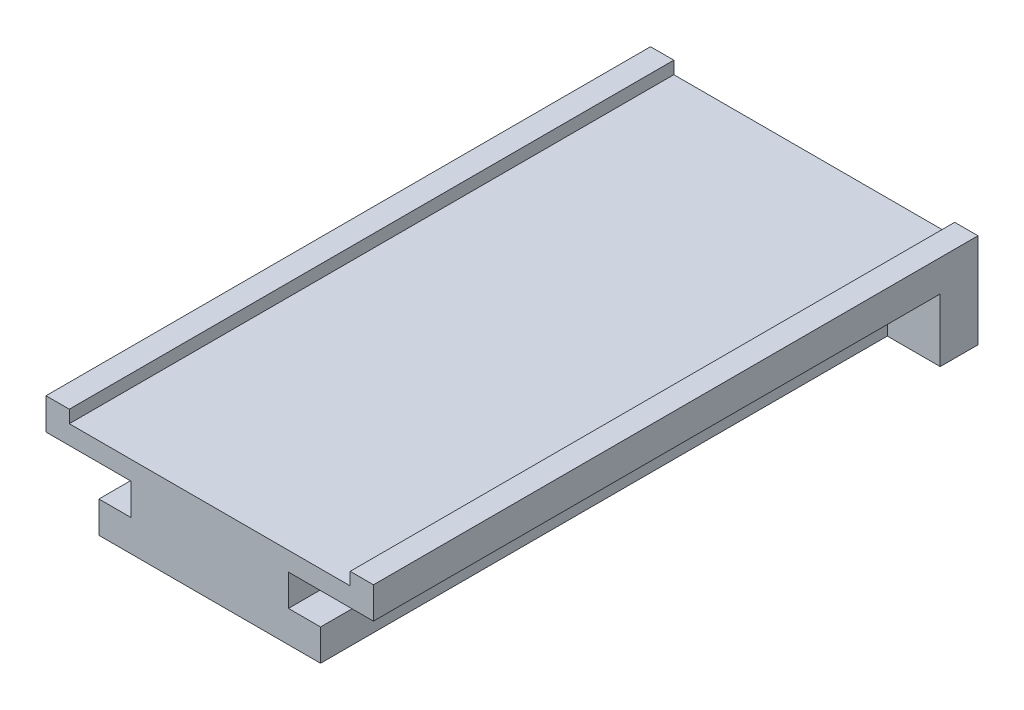
ISO-10303-21;
HEADER;
FILE_DESCRIPTION(('STEP AP214'),'2;1');
FILE_NAME('part.step','',(''),(''),'','','');
FILE_SCHEMA(('AUTOMOTIVE_DESIGN { 1 0 10303 214 1 1 1 1 }'));
ENDSEC;
DATA;
#1=APPLICATION_CONTEXT('core data for automotive mechanical design processes');
#2=APPLICATION_PROTOCOL_DEFINITION('international standard','automotive_design',2000,#1);
#3=PRODUCT_CONTEXT('',#1,'mechanical');
#4=PRODUCT('Part','Part','',(#3));
#5=PRODUCT_RELATED_PRODUCT_CATEGORY('part','',(#4));
#6=PRODUCT_DEFINITION_FORMATION('','',#4);
#7=PRODUCT_DEFINITION_CONTEXT('part definition',#1,'design');
#8=PRODUCT_DEFINITION('design','',#6,#7);
#9=PRODUCT_DEFINITION_SHAPE('','',#8);
#10=(LENGTH_UNIT() NAMED_UNIT(*) SI_UNIT(.MILLI.,.METRE.));
#11=(NAMED_UNIT(*) PLANE_ANGLE_UNIT() SI_UNIT($,.RADIAN.));
#12=(NAMED_UNIT(*) SI_UNIT($,.STERADIAN.) SOLID_ANGLE_UNIT());
#13=UNCERTAINTY_MEASURE_WITH_UNIT(LENGTH_MEASURE(1.E-05),#10,'distance_accuracy_value','');
#14=(GEOMETRIC_REPRESENTATION_CONTEXT(3) GLOBAL_UNCERTAINTY_ASSIGNED_CONTEXT((#13)) GLOBAL_UNIT_ASSIGNED_CONTEXT((#10,
#11,#12)) REPRESENTATION_CONTEXT('',''));
#15=CARTESIAN_POINT('',(0.,0.,0.));
#16=DIRECTION('',(0.,0.,1.));
#17=DIRECTION('',(1.,0.,0.));
#18=AXIS2_PLACEMENT_3D('',#15,#16,#17);
#19=CARTESIAN_POINT('',(0.,2.78985507246377,45.));
#20=DIRECTION('',(0.,1.,0.));
#21=DIRECTION('',(0.,0.,1.));
#22=AXIS2_PLACEMENT_3D('',#19,#20,#21);
#23=PLANE('',#22);
#24=DIRECTION('',(1.,0.,0.));
#25=VECTOR('',#24,1.);
#26=CARTESIAN_POINT('',(9.79710144927535,2.78985507246377,-3.));
#27=LINE('',#26,#25);
#28=CARTESIAN_POINT('',(7.94710144927535,2.78985507246377,-3.));
#29=VERTEX_POINT('',#28);
#30=CARTESIAN_POINT('',(9.79710144927535,2.78985507246377,-3.));
#31=VERTEX_POINT('',#30);
#32=EDGE_CURVE('E170',#29,#31,#27,.T.);
#33=ORIENTED_EDGE('',*,*,#32,.F.);
#34=DIRECTION('',(0.,0.,1.));
#35=VECTOR('',#34,1.);
#36=CARTESIAN_POINT('',(7.94710144927535,2.78985507246377,0.));
#37=LINE('',#36,#35);
#38=CARTESIAN_POINT('',(7.94710144927535,2.78985507246377,45.));
#39=VERTEX_POINT('',#38);
#40=EDGE_CURVE('E325',#29,#39,#37,.T.);
#41=ORIENTED_EDGE('',*,*,#40,.T.);
#42=DIRECTION('',(1.,0.,0.));
#43=VECTOR('',#42,1.);
#44=CARTESIAN_POINT('',(0.,2.78985507246377,45.));
#45=LINE('',#44,#43);
#46=CARTESIAN_POINT('',(9.79710144927535,2.78985507246377,45.));
#47=VERTEX_POINT('',#46);
#48=EDGE_CURVE('E172',#39,#47,#45,.T.);
#49=ORIENTED_EDGE('',*,*,#48,.T.);
#50=DIRECTION('',(0.,0.,-1.));
#51=VECTOR('',#50,1.);
#52=CARTESIAN_POINT('',(9.79710144927535,2.78985507246377,45.));
#53=LINE('',#52,#51);
#54=EDGE_CURVE('E50',#47,#31,#53,.T.);
#55=ORIENTED_EDGE('',*,*,#54,.T.);
#56=EDGE_LOOP('',(#33,#41,#49,#55));
#57=FACE_BOUND('',#56,.T.);
#58=ADVANCED_FACE('F41',(#57),#23,.T.);
#59=CARTESIAN_POINT('',(0.,0.289855072463773,45.));
#60=DIRECTION('',(0.,1.,0.));
#61=DIRECTION('',(0.,0.,1.));
#62=AXIS2_PLACEMENT_3D('',#59,#60,#61);
#63=PLANE('',#62);
#64=DIRECTION('',(1.,0.,0.));
#65=VECTOR('',#64,1.);
#66=CARTESIAN_POINT('',(0.,0.289855072463773,0.));
#67=LINE('',#66,#65);
#68=CARTESIAN_POINT('',(3.04710144927535,0.289855072463773,0.));
#69=VERTEX_POINT('',#68);
#70=CARTESIAN_POINT('',(9.79710144927535,0.289855072463773,0.));
#71=VERTEX_POINT('',#70);
#72=EDGE_CURVE('E142',#69,#71,#67,.T.);
#73=ORIENTED_EDGE('',*,*,#72,.T.);
#74=DIRECTION('',(0.,0.,-1.));
#75=VECTOR('',#74,1.);
#76=CARTESIAN_POINT('',(9.79710144927535,0.289855072463773,45.));
#77=LINE('',#76,#75);
#78=CARTESIAN_POINT('',(9.79710144927535,0.289855072463773,45.));
#79=VERTEX_POINT('',#78);
#80=EDGE_CURVE('E11',#79,#71,#77,.T.);
#81=ORIENTED_EDGE('',*,*,#80,.F.);
#82=DIRECTION('',(1.,0.,0.));
#83=VECTOR('',#82,1.);
#84=CARTESIAN_POINT('',(0.,0.289855072463773,45.));
#85=LINE('',#84,#83);
#86=CARTESIAN_POINT('',(3.04710144927535,0.289855072463773,45.));
#87=VERTEX_POINT('',#86);
#88=EDGE_CURVE('E155',#87,#79,#85,.T.);
#89=ORIENTED_EDGE('',*,*,#88,.F.);
#90=DIRECTION('',(0.,0.,-1.));
#91=VECTOR('',#90,1.);
#92=CARTESIAN_POINT('',(3.04710144927535,0.289855072463773,45.));
#93=LINE('',#92,#91);
#94=EDGE_CURVE('E66',#87,#69,#93,.T.);
#95=ORIENTED_EDGE('',*,*,#94,.T.);
#96=EDGE_LOOP('',(#73,#81,#89,#95));
#97=FACE_BOUND('',#96,.T.);
#98=ADVANCED_FACE('F43',(#97),#63,.F.);
#99=CARTESIAN_POINT('',(9.79710144927535,0.,45.));
#100=DIRECTION('',(-1.,0.,0.));
#101=DIRECTION('',(0.,0.,1.));
#102=AXIS2_PLACEMENT_3D('',#99,#100,#101);
#103=PLANE('',#102);
#104=ORIENTED_EDGE('',*,*,#80,.T.);
#105=DIRECTION('',(0.,-1.,0.));
#106=VECTOR('',#105,1.);
#107=CARTESIAN_POINT('',(9.79710144927535,2.78985507246377,0.));
#108=LINE('',#107,#106);
#109=CARTESIAN_POINT('',(9.79710144927535,-4.71014492753623,0.));
#110=VERTEX_POINT('',#109);
#111=EDGE_CURVE('E209',#71,#110,#108,.T.);
#112=ORIENTED_EDGE('',*,*,#111,.T.);
#113=DIRECTION('',(0.,0.,1.));
#114=VECTOR('',#113,1.);
#115=CARTESIAN_POINT('',(9.79710144927535,-4.71014492753623,-3.));
#116=LINE('',#115,#114);
#117=CARTESIAN_POINT('',(9.79710144927535,-4.71014492753623,-3.));
#118=VERTEX_POINT('',#117);
#119=EDGE_CURVE('E183',#118,#110,#116,.T.);
#120=ORIENTED_EDGE('',*,*,#119,.F.);
#121=DIRECTION('',(0.,-1.,0.));
#122=VECTOR('',#121,1.);
#123=CARTESIAN_POINT('',(9.79710144927535,2.78985507246377,-3.));
#124=LINE('',#123,#122);
#125=EDGE_CURVE('E178',#31,#118,#124,.T.);
#126=ORIENTED_EDGE('',*,*,#125,.F.);
#127=ORIENTED_EDGE('',*,*,#54,.F.);
#128=DIRECTION('',(0.,1.,0.));
#129=VECTOR('',#128,1.);
#130=CARTESIAN_POINT('',(9.79710144927535,0.,45.));
#131=LINE('',#130,#129);
#132=EDGE_CURVE('E94',#79,#47,#131,.T.);
#133=ORIENTED_EDGE('',*,*,#132,.F.);
#134=EDGE_LOOP('',(#104,#112,#120,#126,#127,#133));
#135=FACE_BOUND('',#134,.T.);
#136=ADVANCED_FACE('F179',(#135),#103,.F.);
#137=DIRECTION('',(0.,0.,1.));
#138=VECTOR('',#137,1.);
#139=CARTESIAN_POINT('',(-14.3528985507247,2.78985507246377,0.));
#140=LINE('',#139,#138);
#141=CARTESIAN_POINT('',(-14.3528985507247,2.78985507246377,-3.));
#142=VERTEX_POINT('',#141);
#143=CARTESIAN_POINT('',(-14.3528985507247,2.78985507246377,45.));
#144=VERTEX_POINT('',#143);
#145=EDGE_CURVE('E320',#142,#144,#140,.T.);
#146=ORIENTED_EDGE('',*,*,#145,.F.);
#147=CARTESIAN_POINT('',(-16.2028985507246,2.78985507246377,-3.));
#148=VERTEX_POINT('',#147);
#149=EDGE_CURVE('E204',#148,#142,#27,.T.);
#150=ORIENTED_EDGE('',*,*,#149,.F.);
#151=DIRECTION('',(0.,0.,-1.));
#152=VECTOR('',#151,1.);
#153=CARTESIAN_POINT('',(-16.2028985507246,2.78985507246377,45.));
#154=LINE('',#153,#152);
#155=CARTESIAN_POINT('',(-16.2028985507246,2.78985507246377,45.));
#156=VERTEX_POINT('',#155);
#157=EDGE_CURVE('E269',#156,#148,#154,.T.);
#158=ORIENTED_EDGE('',*,*,#157,.F.);
#159=EDGE_CURVE('E292',#156,#144,#45,.T.);
#160=ORIENTED_EDGE('',*,*,#159,.T.);
#161=EDGE_LOOP('',(#146,#150,#158,#160));
#162=FACE_BOUND('',#161,.T.);
#163=ADVANCED_FACE('F412',(#162),#23,.T.);
#164=CARTESIAN_POINT('',(0.,-4.71014492753623,45.));
#165=DIRECTION('',(0.,1.,0.));
#166=DIRECTION('',(0.,0.,1.));
#167=AXIS2_PLACEMENT_3D('',#164,#165,#166);
#168=PLANE('',#167);
#169=CARTESIAN_POINT('',(-3.20289855072465,-4.71014492753623,32.5));
#170=DIRECTION('',(0.,-1.,0.));
#171=DIRECTION('',(0.,0.,-1.));
#172=AXIS2_PLACEMENT_3D('',#169,#170,#171);
#173=CIRCLE('',#172,1.5);
#174=CARTESIAN_POINT('',(-3.20289855072465,-4.71014492753623,31.));
#175=VERTEX_POINT('',#174);
#176=EDGE_CURVE('E223',#175,#175,#173,.T.);
#177=ORIENTED_EDGE('',*,*,#176,.F.);
#178=EDGE_LOOP('',(#177));
#179=FACE_BOUND('',#178,.T.);
#180=CARTESIAN_POINT('',(-3.20289855072465,-4.71014492753623,12.5));
#181=DIRECTION('',(0.,-1.,0.));
#182=DIRECTION('',(0.,0.,1.));
#183=AXIS2_PLACEMENT_3D('',#180,#181,#182);
#184=CIRCLE('',#183,1.5);
#185=CARTESIAN_POINT('',(-3.20289855072465,-4.71014492753623,14.));
#186=VERTEX_POINT('',#185);
#187=EDGE_CURVE('E222',#186,#186,#184,.T.);
#188=ORIENTED_EDGE('',*,*,#187,.F.);
#189=EDGE_LOOP('',(#188));
#190=FACE_BOUND('',#189,.T.);
#191=DIRECTION('',(0.,0.,-1.));
#192=VECTOR('',#191,1.);
#193=CARTESIAN_POINT('',(-12.0028985507247,-4.71014492753623,45.));
#194=LINE('',#193,#192);
#195=CARTESIAN_POINT('',(-12.0028985507247,-4.71014492753623,45.));
#196=VERTEX_POINT('',#195);
#197=CARTESIAN_POINT('',(-12.0028985507247,-4.71014492753623,0.));
#198=VERTEX_POINT('',#197);
#199=EDGE_CURVE('E273',#196,#198,#194,.T.);
#200=ORIENTED_EDGE('',*,*,#199,.T.);
#201=DIRECTION('',(-1.,0.,0.));
#202=VECTOR('',#201,1.);
#203=CARTESIAN_POINT('',(9.79710144927535,-4.71014492753623,0.));
#204=LINE('',#203,#202);
#205=CARTESIAN_POINT('',(-16.2028985507246,-4.71014492753623,0.));
#206=VERTEX_POINT('',#205);
#207=EDGE_CURVE('E212',#198,#206,#204,.T.);
#208=ORIENTED_EDGE('',*,*,#207,.T.);
#209=DIRECTION('',(0.,0.,1.));
#210=VECTOR('',#209,1.);
#211=CARTESIAN_POINT('',(-16.2028985507246,-4.71014492753623,-3.));
#212=LINE('',#211,#210);
#213=CARTESIAN_POINT('',(-16.2028985507246,-4.71014492753623,-3.));
#214=VERTEX_POINT('',#213);
#215=EDGE_CURVE('E208',#214,#206,#212,.T.);
#216=ORIENTED_EDGE('',*,*,#215,.F.);
#217=DIRECTION('',(-1.,0.,0.));
#218=VECTOR('',#217,1.);
#219=CARTESIAN_POINT('',(9.79710144927535,-4.71014492753623,-3.));
#220=LINE('',#219,#218);
#221=EDGE_CURVE('E187',#118,#214,#220,.T.);
#222=ORIENTED_EDGE('',*,*,#221,.F.);
#223=ORIENTED_EDGE('',*,*,#119,.T.);
#224=CARTESIAN_POINT('',(5.59710144927535,-4.71014492753623,0.));
#225=VERTEX_POINT('',#224);
#226=EDGE_CURVE('E195',#110,#225,#204,.T.);
#227=ORIENTED_EDGE('',*,*,#226,.T.);
#228=DIRECTION('',(0.,0.,-1.));
#229=VECTOR('',#228,1.);
#230=CARTESIAN_POINT('',(5.59710144927535,-4.71014492753623,45.));
#231=LINE('',#230,#229);
#232=CARTESIAN_POINT('',(5.59710144927535,-4.71014492753623,45.));
#233=VERTEX_POINT('',#232);
#234=EDGE_CURVE('E119',#233,#225,#231,.T.);
#235=ORIENTED_EDGE('',*,*,#234,.F.);
#236=DIRECTION('',(1.,0.,0.));
#237=VECTOR('',#236,1.);
#238=CARTESIAN_POINT('',(0.,-4.71014492753623,45.));
#239=LINE('',#238,#237);
#240=EDGE_CURVE('E130',#196,#233,#239,.T.);
#241=ORIENTED_EDGE('',*,*,#240,.F.);
#242=EDGE_LOOP('',(#200,#208,#216,#222,#223,#227,#235,#241));
#243=FACE_BOUND('',#242,.T.);
#244=ADVANCED_FACE('F392',(#179,#190,#243),#168,.F.);
#245=CARTESIAN_POINT('',(5.59710144927535,0.,45.));
#246=DIRECTION('',(1.,0.,0.));
#247=DIRECTION('',(0.,1.,0.));
#248=AXIS2_PLACEMENT_3D('',#245,#246,#247);
#249=PLANE('',#248);
#250=DIRECTION('',(0.,-1.,0.));
#251=VECTOR('',#250,1.);
#252=CARTESIAN_POINT('',(5.59710144927535,0.,0.));
#253=LINE('',#252,#251);
#254=CARTESIAN_POINT('',(5.59710144927535,-2.21014492753623,0.));
#255=VERTEX_POINT('',#254);
#256=EDGE_CURVE('E113',#255,#225,#253,.T.);
#257=ORIENTED_EDGE('',*,*,#256,.F.);
#258=DIRECTION('',(0.,0.,-1.));
#259=VECTOR('',#258,1.);
#260=CARTESIAN_POINT('',(5.59710144927535,-2.21014492753623,45.));
#261=LINE('',#260,#259);
#262=CARTESIAN_POINT('',(5.59710144927535,-2.21014492753623,45.));
#263=VERTEX_POINT('',#262);
#264=EDGE_CURVE('E108',#263,#255,#261,.T.);
#265=ORIENTED_EDGE('',*,*,#264,.F.);
#266=DIRECTION('',(0.,-1.,0.));
#267=VECTOR('',#266,1.);
#268=CARTESIAN_POINT('',(5.59710144927535,0.,45.));
#269=LINE('',#268,#267);
#270=EDGE_CURVE('E111',#263,#233,#269,.T.);
#271=ORIENTED_EDGE('',*,*,#270,.T.);
#272=ORIENTED_EDGE('',*,*,#234,.T.);
#273=EDGE_LOOP('',(#257,#265,#271,#272));
#274=FACE_BOUND('',#273,.T.);
#275=ADVANCED_FACE('F110',(#274),#249,.T.);
#276=CARTESIAN_POINT('',(0.,-2.21014492753623,45.));
#277=DIRECTION('',(0.,1.,0.));
#278=DIRECTION('',(0.,0.,1.));
#279=AXIS2_PLACEMENT_3D('',#276,#277,#278);
#280=PLANE('',#279);
#281=DIRECTION('',(1.,0.,0.));
#282=VECTOR('',#281,1.);
#283=CARTESIAN_POINT('',(0.,-2.21014492753623,0.));
#284=LINE('',#283,#282);
#285=CARTESIAN_POINT('',(3.04710144927535,-2.21014492753623,0.));
#286=VERTEX_POINT('',#285);
#287=EDGE_CURVE('E148',#286,#255,#284,.T.);
#288=ORIENTED_EDGE('',*,*,#287,.F.);
#289=DIRECTION('',(0.,0.,-1.));
#290=VECTOR('',#289,1.);
#291=CARTESIAN_POINT('',(3.04710144927535,-2.21014492753623,45.));
#292=LINE('',#291,#290);
#293=CARTESIAN_POINT('',(3.04710144927535,-2.21014492753623,45.));
#294=VERTEX_POINT('',#293);
#295=EDGE_CURVE('E120',#294,#286,#292,.T.);
#296=ORIENTED_EDGE('',*,*,#295,.F.);
#297=DIRECTION('',(1.,0.,0.));
#298=VECTOR('',#297,1.);
#299=CARTESIAN_POINT('',(0.,-2.21014492753623,45.));
#300=LINE('',#299,#298);
#301=EDGE_CURVE('E127',#294,#263,#300,.T.);
#302=ORIENTED_EDGE('',*,*,#301,.T.);
#303=ORIENTED_EDGE('',*,*,#264,.T.);
#304=EDGE_LOOP('',(#288,#296,#302,#303));
#305=FACE_BOUND('',#304,.T.);
#306=ADVANCED_FACE('F134',(#305),#280,.T.);
#307=CARTESIAN_POINT('',(3.04710144927535,0.,45.));
#308=DIRECTION('',(1.,0.,0.));
#309=DIRECTION('',(0.,0.,-1.));
#310=AXIS2_PLACEMENT_3D('',#307,#308,#309);
#311=PLANE('',#310);
#312=DIRECTION('',(0.,-1.,0.));
#313=VECTOR('',#312,1.);
#314=CARTESIAN_POINT('',(3.04710144927535,0.,0.));
#315=LINE('',#314,#313);
#316=EDGE_CURVE('E151',#69,#286,#315,.T.);
#317=ORIENTED_EDGE('',*,*,#316,.F.);
#318=ORIENTED_EDGE('',*,*,#94,.F.);
#319=DIRECTION('',(0.,-1.,0.));
#320=VECTOR('',#319,1.);
#321=CARTESIAN_POINT('',(3.04710144927535,0.,45.));
#322=LINE('',#321,#320);
#323=EDGE_CURVE('E136',#87,#294,#322,.T.);
#324=ORIENTED_EDGE('',*,*,#323,.T.);
#325=ORIENTED_EDGE('',*,*,#295,.T.);
#326=EDGE_LOOP('',(#317,#318,#324,#325));
#327=FACE_BOUND('',#326,.T.);
#328=ADVANCED_FACE('F517',(#327),#311,.T.);
#329=CARTESIAN_POINT('',(0.,0.,45.));
#330=DIRECTION('',(0.,0.,1.));
#331=DIRECTION('',(1.,0.,0.));
#332=AXIS2_PLACEMENT_3D('',#329,#330,#331);
#333=PLANE('',#332);
#334=DIRECTION('',(0.,1.,0.));
#335=VECTOR('',#334,1.);
#336=CARTESIAN_POINT('',(-14.3528985507247,1.78985507246377,45.));
#337=LINE('',#336,#335);
#338=CARTESIAN_POINT('',(-14.3528985507247,1.78985507246377,45.));
#339=VERTEX_POINT('',#338);
#340=EDGE_CURVE('E213',#339,#144,#337,.T.);
#341=ORIENTED_EDGE('',*,*,#340,.T.);
#342=ORIENTED_EDGE('',*,*,#159,.F.);
#343=DIRECTION('',(0.,1.,0.));
#344=VECTOR('',#343,1.);
#345=CARTESIAN_POINT('',(-16.2028985507246,0.,45.));
#346=LINE('',#345,#344);
#347=CARTESIAN_POINT('',(-16.2028985507246,0.289855072463773,45.));
#348=VERTEX_POINT('',#347);
#349=EDGE_CURVE('E247',#348,#156,#346,.T.);
#350=ORIENTED_EDGE('',*,*,#349,.F.);
#351=DIRECTION('',(-1.,0.,0.));
#352=VECTOR('',#351,1.);
#353=CARTESIAN_POINT('',(-6.4057971014493,0.289855072463773,45.));
#354=LINE('',#353,#352);
#355=CARTESIAN_POINT('',(-9.45289855072465,0.289855072463773,45.));
#356=VERTEX_POINT('',#355);
#357=EDGE_CURVE('E231',#356,#348,#354,.T.);
#358=ORIENTED_EDGE('',*,*,#357,.F.);
#359=DIRECTION('',(0.,-1.,0.));
#360=VECTOR('',#359,1.);
#361=CARTESIAN_POINT('',(-9.45289855072465,0.,45.));
#362=LINE('',#361,#360);
#363=CARTESIAN_POINT('',(-9.45289855072465,-2.21014492753623,45.));
#364=VERTEX_POINT('',#363);
#365=EDGE_CURVE('E235',#356,#364,#362,.T.);
#366=ORIENTED_EDGE('',*,*,#365,.T.);
#367=DIRECTION('',(-1.,0.,0.));
#368=VECTOR('',#367,1.);
#369=CARTESIAN_POINT('',(-6.4057971014493,-2.21014492753623,45.));
#370=LINE('',#369,#368);
#371=CARTESIAN_POINT('',(-12.0028985507247,-2.21014492753623,45.));
#372=VERTEX_POINT('',#371);
#373=EDGE_CURVE('E240',#364,#372,#370,.T.);
#374=ORIENTED_EDGE('',*,*,#373,.T.);
#375=DIRECTION('',(0.,-1.,0.));
#376=VECTOR('',#375,1.);
#377=CARTESIAN_POINT('',(-12.0028985507246,0.,45.));
#378=LINE('',#377,#376);
#379=EDGE_CURVE('E244',#372,#196,#378,.T.);
#380=ORIENTED_EDGE('',*,*,#379,.T.);
#381=ORIENTED_EDGE('',*,*,#240,.T.);
#382=ORIENTED_EDGE('',*,*,#270,.F.);
#383=ORIENTED_EDGE('',*,*,#301,.F.);
#384=ORIENTED_EDGE('',*,*,#323,.F.);
#385=ORIENTED_EDGE('',*,*,#88,.T.);
#386=ORIENTED_EDGE('',*,*,#132,.T.);
#387=ORIENTED_EDGE('',*,*,#48,.F.);
#388=DIRECTION('',(0.,1.,0.));
#389=VECTOR('',#388,1.);
#390=CARTESIAN_POINT('',(7.94710144927535,1.78985507246377,45.));
#391=LINE('',#390,#389);
#392=CARTESIAN_POINT('',(7.94710144927535,1.78985507246377,45.));
#393=VERTEX_POINT('',#392);
#394=EDGE_CURVE('E198',#393,#39,#391,.T.);
#395=ORIENTED_EDGE('',*,*,#394,.F.);
#396=DIRECTION('',(1.,0.,0.));
#397=VECTOR('',#396,1.);
#398=CARTESIAN_POINT('',(0.,1.78985507246377,45.));
#399=LINE('',#398,#397);
#400=EDGE_CURVE('E324',#339,#393,#399,.T.);
#401=ORIENTED_EDGE('',*,*,#400,.F.);
#402=EDGE_LOOP('',(#341,#342,#350,#358,#366,#374,#380,#381,#382,#383,#384,#385,#386,#387,#395,#401));
#403=FACE_BOUND('',#402,.T.);
#404=ADVANCED_FACE('F125',(#403),#333,.T.);
#405=CARTESIAN_POINT('',(-6.4057971014493,0.289855072463773,45.));
#406=DIRECTION('',(0.,-1.,0.));
#407=DIRECTION('',(0.,0.,-1.));
#408=AXIS2_PLACEMENT_3D('',#405,#406,#407);
#409=PLANE('',#408);
#410=DIRECTION('',(-1.,0.,0.));
#411=VECTOR('',#410,1.);
#412=CARTESIAN_POINT('',(-6.4057971014493,0.289855072463773,0.));
#413=LINE('',#412,#411);
#414=CARTESIAN_POINT('',(-9.45289855072465,0.289855072463773,0.));
#415=VERTEX_POINT('',#414);
#416=CARTESIAN_POINT('',(-16.2028985507246,0.289855072463773,0.));
#417=VERTEX_POINT('',#416);
#418=EDGE_CURVE('E227',#415,#417,#413,.T.);
#419=ORIENTED_EDGE('',*,*,#418,.F.);
#420=DIRECTION('',(0.,0.,-1.));
#421=VECTOR('',#420,1.);
#422=CARTESIAN_POINT('',(-9.45289855072465,0.289855072463773,45.));
#423=LINE('',#422,#421);
#424=EDGE_CURVE('E145',#356,#415,#423,.T.);
#425=ORIENTED_EDGE('',*,*,#424,.F.);
#426=ORIENTED_EDGE('',*,*,#357,.T.);
#427=DIRECTION('',(0.,0.,-1.));
#428=VECTOR('',#427,1.);
#429=CARTESIAN_POINT('',(-16.2028985507246,0.289855072463773,45.));
#430=LINE('',#429,#428);
#431=EDGE_CURVE('E251',#348,#417,#430,.T.);
#432=ORIENTED_EDGE('',*,*,#431,.T.);
#433=EDGE_LOOP('',(#419,#425,#426,#432));
#434=FACE_BOUND('',#433,.T.);
#435=ADVANCED_FACE('F421',(#434),#409,.T.);
#436=CARTESIAN_POINT('',(-9.45289855072465,0.,45.));
#437=DIRECTION('',(1.,0.,0.));
#438=DIRECTION('',(0.,0.,-1.));
#439=AXIS2_PLACEMENT_3D('',#436,#437,#438);
#440=PLANE('',#439);
#441=DIRECTION('',(0.,-1.,0.));
#442=VECTOR('',#441,1.);
#443=CARTESIAN_POINT('',(-9.45289855072465,0.,0.));
#444=LINE('',#443,#442);
#445=CARTESIAN_POINT('',(-9.45289855072465,-2.21014492753623,0.));
#446=VERTEX_POINT('',#445);
#447=EDGE_CURVE('E255',#415,#446,#444,.T.);
#448=ORIENTED_EDGE('',*,*,#447,.T.);
#449=DIRECTION('',(0.,0.,-1.));
#450=VECTOR('',#449,1.);
#451=CARTESIAN_POINT('',(-9.45289855072465,-2.21014492753623,45.));
#452=LINE('',#451,#450);
#453=EDGE_CURVE('E281',#364,#446,#452,.T.);
#454=ORIENTED_EDGE('',*,*,#453,.F.);
#455=ORIENTED_EDGE('',*,*,#365,.F.);
#456=ORIENTED_EDGE('',*,*,#424,.T.);
#457=EDGE_LOOP('',(#448,#454,#455,#456));
#458=FACE_BOUND('',#457,.T.);
#459=ADVANCED_FACE('F423',(#458),#440,.F.);
#460=CARTESIAN_POINT('',(-6.4057971014493,-2.21014492753623,45.));
#461=DIRECTION('',(0.,-1.,0.));
#462=DIRECTION('',(0.,0.,-1.));
#463=AXIS2_PLACEMENT_3D('',#460,#461,#462);
#464=PLANE('',#463);
#465=DIRECTION('',(-1.,0.,0.));
#466=VECTOR('',#465,1.);
#467=CARTESIAN_POINT('',(-6.4057971014493,-2.21014492753623,0.));
#468=LINE('',#467,#466);
#469=CARTESIAN_POINT('',(-12.0028985507247,-2.21014492753623,0.));
#470=VERTEX_POINT('',#469);
#471=EDGE_CURVE('E259',#446,#470,#468,.T.);
#472=ORIENTED_EDGE('',*,*,#471,.T.);
#473=DIRECTION('',(0.,0.,-1.));
#474=VECTOR('',#473,1.);
#475=CARTESIAN_POINT('',(-12.0028985507247,-2.21014492753623,45.));
#476=LINE('',#475,#474);
#477=EDGE_CURVE('E277',#372,#470,#476,.T.);
#478=ORIENTED_EDGE('',*,*,#477,.F.);
#479=ORIENTED_EDGE('',*,*,#373,.F.);
#480=ORIENTED_EDGE('',*,*,#453,.T.);
#481=EDGE_LOOP('',(#472,#478,#479,#480));
#482=FACE_BOUND('',#481,.T.);
#483=ADVANCED_FACE('F425',(#482),#464,.F.);
#484=CARTESIAN_POINT('',(-12.0028985507246,0.,45.));
#485=DIRECTION('',(1.,0.,0.));
#486=DIRECTION('',(0.,1.,0.));
#487=AXIS2_PLACEMENT_3D('',#484,#485,#486);
#488=PLANE('',#487);
#489=DIRECTION('',(0.,-1.,0.));
#490=VECTOR('',#489,1.);
#491=CARTESIAN_POINT('',(-12.0028985507246,0.,0.));
#492=LINE('',#491,#490);
#493=EDGE_CURVE('E236',#470,#198,#492,.T.);
#494=ORIENTED_EDGE('',*,*,#493,.T.);
#495=ORIENTED_EDGE('',*,*,#199,.F.);
#496=ORIENTED_EDGE('',*,*,#379,.F.);
#497=ORIENTED_EDGE('',*,*,#477,.T.);
#498=EDGE_LOOP('',(#494,#495,#496,#497));
#499=FACE_BOUND('',#498,.T.);
#500=ADVANCED_FACE('F398',(#499),#488,.F.);
#501=CARTESIAN_POINT('',(-16.2028985507246,0.,45.));
#502=DIRECTION('',(-1.,0.,0.));
#503=DIRECTION('',(0.,0.,1.));
#504=AXIS2_PLACEMENT_3D('',#501,#502,#503);
#505=PLANE('',#504);
#506=ORIENTED_EDGE('',*,*,#157,.T.);
#507=DIRECTION('',(0.,1.,0.));
#508=VECTOR('',#507,1.);
#509=CARTESIAN_POINT('',(-16.2028985507246,2.78985507246377,-3.));
#510=LINE('',#509,#508);
#511=EDGE_CURVE('E192',#214,#148,#510,.T.);
#512=ORIENTED_EDGE('',*,*,#511,.F.);
#513=ORIENTED_EDGE('',*,*,#215,.T.);
#514=DIRECTION('',(0.,1.,0.));
#515=VECTOR('',#514,1.);
#516=CARTESIAN_POINT('',(-16.2028985507246,2.78985507246377,0.));
#517=LINE('',#516,#515);
#518=EDGE_CURVE('E188',#206,#417,#517,.T.);
#519=ORIENTED_EDGE('',*,*,#518,.T.);
#520=ORIENTED_EDGE('',*,*,#431,.F.);
#521=ORIENTED_EDGE('',*,*,#349,.T.);
#522=EDGE_LOOP('',(#506,#512,#513,#519,#520,#521));
#523=FACE_BOUND('',#522,.T.);
#524=ADVANCED_FACE('F406',(#523),#505,.T.);
#525=CARTESIAN_POINT('',(-3.20289855072465,-4.71014492753623,12.5));
#526=DIRECTION('',(0.,-1.,0.));
#527=DIRECTION('',(0.,0.,1.));
#528=AXIS2_PLACEMENT_3D('',#525,#526,#527);
#529=CONICAL_SURFACE('',#528,1.5,0.78539816339745);
#530=CARTESIAN_POINT('',(-3.20289855072465,-3.21014492753623,12.5));
#531=VERTEX_POINT('',#530);
#532=VERTEX_LOOP('',#531);
#533=FACE_BOUND('',#532,.T.);
#534=ORIENTED_EDGE('',*,*,#187,.T.);
#535=EDGE_LOOP('',(#534));
#536=FACE_BOUND('',#535,.T.);
#537=ADVANCED_FACE('F466',(#533,#536),#529,.F.);
#538=CARTESIAN_POINT('',(-3.20289855072465,-4.71014492753623,32.5));
#539=DIRECTION('',(0.,-1.,0.));
#540=DIRECTION('',(0.,0.,-1.));
#541=AXIS2_PLACEMENT_3D('',#538,#539,#540);
#542=CONICAL_SURFACE('',#541,1.5,0.78539816339745);
#543=CARTESIAN_POINT('',(-3.20289855072465,-3.21014492753623,32.5));
#544=VERTEX_POINT('',#543);
#545=VERTEX_LOOP('',#544);
#546=FACE_BOUND('',#545,.T.);
#547=ORIENTED_EDGE('',*,*,#176,.T.);
#548=EDGE_LOOP('',(#547));
#549=FACE_BOUND('',#548,.T.);
#550=ADVANCED_FACE('F460',(#546,#549),#542,.F.);
#551=CARTESIAN_POINT('',(0.,0.,0.));
#552=DIRECTION('',(0.,0.,-1.));
#553=DIRECTION('',(-1.,0.,0.));
#554=AXIS2_PLACEMENT_3D('',#551,#552,#553);
#555=PLANE('',#554);
#556=ORIENTED_EDGE('',*,*,#72,.F.);
#557=ORIENTED_EDGE('',*,*,#316,.T.);
#558=ORIENTED_EDGE('',*,*,#287,.T.);
#559=ORIENTED_EDGE('',*,*,#256,.T.);
#560=ORIENTED_EDGE('',*,*,#226,.F.);
#561=ORIENTED_EDGE('',*,*,#111,.F.);
#562=EDGE_LOOP('',(#556,#557,#558,#559,#560,#561));
#563=FACE_BOUND('',#562,.T.);
#564=ADVANCED_FACE('F465',(#563),#555,.F.);
#565=CARTESIAN_POINT('',(0.,0.,-3.));
#566=DIRECTION('',(0.,0.,-1.));
#567=DIRECTION('',(-1.,0.,0.));
#568=AXIS2_PLACEMENT_3D('',#565,#566,#567);
#569=PLANE('',#568);
#570=DIRECTION('',(0.,1.,0.));
#571=VECTOR('',#570,1.);
#572=CARTESIAN_POINT('',(-14.3528985507247,1.78985507246377,-3.));
#573=LINE('',#572,#571);
#574=CARTESIAN_POINT('',(-14.3528985507247,1.78985507246377,-3.));
#575=VERTEX_POINT('',#574);
#576=EDGE_CURVE('E310',#575,#142,#573,.T.);
#577=ORIENTED_EDGE('',*,*,#576,.F.);
#578=DIRECTION('',(-1.,0.,0.));
#579=VECTOR('',#578,1.);
#580=CARTESIAN_POINT('',(0.,1.78985507246377,-3.));
#581=LINE('',#580,#579);
#582=CARTESIAN_POINT('',(7.94710144927535,1.78985507246377,-3.));
#583=VERTEX_POINT('',#582);
#584=EDGE_CURVE('E303',#583,#575,#581,.T.);
#585=ORIENTED_EDGE('',*,*,#584,.F.);
#586=DIRECTION('',(0.,1.,0.));
#587=VECTOR('',#586,1.);
#588=CARTESIAN_POINT('',(7.94710144927535,1.78985507246377,-3.));
#589=LINE('',#588,#587);
#590=EDGE_CURVE('E302',#583,#29,#589,.T.);
#591=ORIENTED_EDGE('',*,*,#590,.T.);
#592=ORIENTED_EDGE('',*,*,#32,.T.);
#593=ORIENTED_EDGE('',*,*,#125,.T.);
#594=ORIENTED_EDGE('',*,*,#221,.T.);
#595=ORIENTED_EDGE('',*,*,#511,.T.);
#596=ORIENTED_EDGE('',*,*,#149,.T.);
#597=EDGE_LOOP('',(#577,#585,#591,#592,#593,#594,#595,#596));
#598=FACE_BOUND('',#597,.T.);
#599=ADVANCED_FACE('F300',(#598),#569,.T.);
#600=ORIENTED_EDGE('',*,*,#493,.F.);
#601=ORIENTED_EDGE('',*,*,#471,.F.);
#602=ORIENTED_EDGE('',*,*,#447,.F.);
#603=ORIENTED_EDGE('',*,*,#418,.T.);
#604=ORIENTED_EDGE('',*,*,#518,.F.);
#605=ORIENTED_EDGE('',*,*,#207,.F.);
#606=EDGE_LOOP('',(#600,#601,#602,#603,#604,#605));
#607=FACE_BOUND('',#606,.T.);
#608=ADVANCED_FACE('F401',(#607),#555,.F.);
#609=CARTESIAN_POINT('',(-14.3528985507247,1.78985507246377,0.));
#610=DIRECTION('',(-1.,0.,0.));
#611=DIRECTION('',(0.,0.,1.));
#612=AXIS2_PLACEMENT_3D('',#609,#610,#611);
#613=PLANE('',#612);
#614=ORIENTED_EDGE('',*,*,#145,.T.);
#615=ORIENTED_EDGE('',*,*,#340,.F.);
#616=DIRECTION('',(0.,0.,1.));
#617=VECTOR('',#616,1.);
#618=CARTESIAN_POINT('',(-14.3528985507247,1.78985507246377,0.));
#619=LINE('',#618,#617);
#620=EDGE_CURVE('E316',#575,#339,#619,.T.);
#621=ORIENTED_EDGE('',*,*,#620,.F.);
#622=ORIENTED_EDGE('',*,*,#576,.T.);
#623=EDGE_LOOP('',(#614,#615,#621,#622));
#624=FACE_BOUND('',#623,.T.);
#625=ADVANCED_FACE('F415',(#624),#613,.F.);
#626=CARTESIAN_POINT('',(7.94710144927535,1.78985507246377,0.));
#627=DIRECTION('',(-1.,0.,0.));
#628=DIRECTION('',(0.,0.,1.));
#629=AXIS2_PLACEMENT_3D('',#626,#627,#628);
#630=PLANE('',#629);
#631=ORIENTED_EDGE('',*,*,#40,.F.);
#632=ORIENTED_EDGE('',*,*,#590,.F.);
#633=DIRECTION('',(0.,0.,1.));
#634=VECTOR('',#633,1.);
#635=CARTESIAN_POINT('',(7.94710144927535,1.78985507246377,0.));
#636=LINE('',#635,#634);
#637=EDGE_CURVE('E57',#583,#393,#636,.T.);
#638=ORIENTED_EDGE('',*,*,#637,.T.);
#639=ORIENTED_EDGE('',*,*,#394,.T.);
#640=EDGE_LOOP('',(#631,#632,#638,#639));
#641=FACE_BOUND('',#640,.T.);
#642=ADVANCED_FACE('F345',(#641),#630,.T.);
#643=CARTESIAN_POINT('',(0.,1.78985507246377,0.));
#644=DIRECTION('',(0.,1.,0.));
#645=DIRECTION('',(0.,0.,1.));
#646=AXIS2_PLACEMENT_3D('',#643,#644,#645);
#647=PLANE('',#646);
#648=ORIENTED_EDGE('',*,*,#400,.T.);
#649=ORIENTED_EDGE('',*,*,#637,.F.);
#650=ORIENTED_EDGE('',*,*,#584,.T.);
#651=ORIENTED_EDGE('',*,*,#620,.T.);
#652=EDGE_LOOP('',(#648,#649,#650,#651));
#653=FACE_BOUND('',#652,.T.);
#654=ADVANCED_FACE('F339',(#653),#647,.T.);
#655=CLOSED_SHELL('',(#58,#98,#136,#163,#244,#275,#306,#328,#404,#435,#459,#483,#500,#524,#537,
#550,#564,#599,#608,#625,#642,#654));
#656=MANIFOLD_SOLID_BREP('B2',#655);
#657=ADVANCED_BREP_SHAPE_REPRESENTATION('',(#18,#656),#14);
#658=SHAPE_DEFINITION_REPRESENTATION(#9,#657);
ENDSEC;
END-ISO-10303-21;
